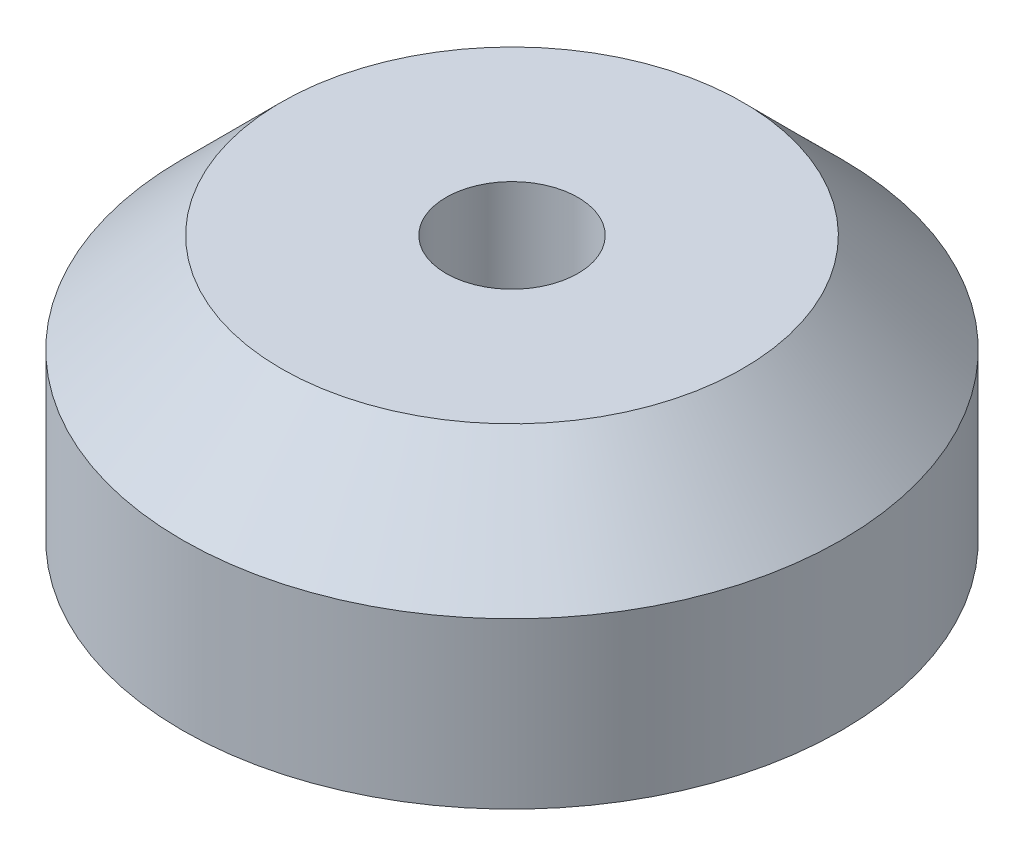
ISO-10303-21;
HEADER;
FILE_DESCRIPTION(('STEP AP214'),'2;1');
FILE_NAME('part.step','',(''),(''),'','','');
FILE_SCHEMA(('AUTOMOTIVE_DESIGN { 1 0 10303 214 1 1 1 1 }'));
ENDSEC;
DATA;
#1=APPLICATION_CONTEXT('core data for automotive mechanical design processes');
#2=APPLICATION_PROTOCOL_DEFINITION('international standard','automotive_design',2000,#1);
#3=PRODUCT_CONTEXT('',#1,'mechanical');
#4=PRODUCT('Part','Part','',(#3));
#5=PRODUCT_RELATED_PRODUCT_CATEGORY('part','',(#4));
#6=PRODUCT_DEFINITION_FORMATION('','',#4);
#7=PRODUCT_DEFINITION_CONTEXT('part definition',#1,'design');
#8=PRODUCT_DEFINITION('design','',#6,#7);
#9=PRODUCT_DEFINITION_SHAPE('','',#8);
#10=(LENGTH_UNIT() NAMED_UNIT(*) SI_UNIT(.MILLI.,.METRE.));
#11=(NAMED_UNIT(*) PLANE_ANGLE_UNIT() SI_UNIT($,.RADIAN.));
#12=(NAMED_UNIT(*) SI_UNIT($,.STERADIAN.) SOLID_ANGLE_UNIT());
#13=UNCERTAINTY_MEASURE_WITH_UNIT(LENGTH_MEASURE(1.E-05),#10,'distance_accuracy_value','');
#14=(GEOMETRIC_REPRESENTATION_CONTEXT(3) GLOBAL_UNCERTAINTY_ASSIGNED_CONTEXT((#13)) GLOBAL_UNIT_ASSIGNED_CONTEXT((#10,
#11,#12)) REPRESENTATION_CONTEXT('',''));
#15=CARTESIAN_POINT('',(0.,0.,0.));
#16=DIRECTION('',(0.,0.,1.));
#17=DIRECTION('',(1.,0.,0.));
#18=AXIS2_PLACEMENT_3D('',#15,#16,#17);
#19=CARTESIAN_POINT('',(0.,0.,0.));
#20=DIRECTION('',(0.,1.,0.));
#21=DIRECTION('',(0.,0.,1.));
#22=AXIS2_PLACEMENT_3D('',#19,#20,#21);
#23=PLANE('',#22);
#24=CARTESIAN_POINT('',(0.,0.,0.));
#25=DIRECTION('',(0.,1.,0.));
#26=DIRECTION('',(0.,0.,1.));
#27=AXIS2_PLACEMENT_3D('',#24,#25,#26);
#28=CIRCLE('',#27,10.);
#29=CARTESIAN_POINT('',(0.,0.,10.));
#30=VERTEX_POINT('',#29);
#31=EDGE_CURVE('E49',#30,#30,#28,.T.);
#32=ORIENTED_EDGE('',*,*,#31,.T.);
#33=EDGE_LOOP('',(#32));
#34=FACE_BOUND('',#33,.T.);
#35=CARTESIAN_POINT('',(0.,0.,0.));
#36=DIRECTION('',(0.,1.,0.));
#37=DIRECTION('',(0.,0.,1.));
#38=AXIS2_PLACEMENT_3D('',#35,#36,#37);
#39=CIRCLE('',#38,13.);
#40=CARTESIAN_POINT('',(0.,0.,13.));
#41=VERTEX_POINT('',#40);
#42=EDGE_CURVE('E60',#41,#41,#39,.T.);
#43=ORIENTED_EDGE('',*,*,#42,.F.);
#44=EDGE_LOOP('',(#43));
#45=FACE_BOUND('',#44,.T.);
#46=ADVANCED_FACE('F31',(#34,#45),#23,.F.);
#47=CARTESIAN_POINT('',(0.,40.,0.));
#48=DIRECTION('',(0.,1.,0.));
#49=DIRECTION('',(0.,0.,1.));
#50=AXIS2_PLACEMENT_3D('',#47,#48,#49);
#51=PLANE('',#50);
#52=CARTESIAN_POINT('',(0.,40.,0.));
#53=DIRECTION('',(0.,1.,0.));
#54=DIRECTION('',(0.,0.,1.));
#55=AXIS2_PLACEMENT_3D('',#52,#53,#54);
#56=CIRCLE('',#55,35.);
#57=CARTESIAN_POINT('',(0.,40.,35.));
#58=VERTEX_POINT('',#57);
#59=EDGE_CURVE('E38',#58,#58,#56,.T.);
#60=ORIENTED_EDGE('',*,*,#59,.T.);
#61=EDGE_LOOP('',(#60));
#62=FACE_BOUND('',#61,.T.);
#63=CARTESIAN_POINT('',(0.,40.,0.));
#64=DIRECTION('',(0.,1.,0.));
#65=DIRECTION('',(0.,0.,1.));
#66=AXIS2_PLACEMENT_3D('',#63,#64,#65);
#67=CIRCLE('',#66,10.);
#68=CARTESIAN_POINT('',(0.,40.,10.));
#69=VERTEX_POINT('',#68);
#70=EDGE_CURVE('E46',#69,#69,#67,.T.);
#71=ORIENTED_EDGE('',*,*,#70,.F.);
#72=EDGE_LOOP('',(#71));
#73=FACE_BOUND('',#72,.T.);
#74=ADVANCED_FACE('F86',(#62,#73),#51,.T.);
#75=CARTESIAN_POINT('',(0.,0.,0.));
#76=DIRECTION('',(0.,1.,0.));
#77=DIRECTION('',(0.,0.,1.));
#78=AXIS2_PLACEMENT_3D('',#75,#76,#77);
#79=CIRCLE('',#78,47.);
#80=CARTESIAN_POINT('',(0.,0.,47.));
#81=VERTEX_POINT('',#80);
#82=EDGE_CURVE('E55',#81,#81,#79,.T.);
#83=ORIENTED_EDGE('',*,*,#82,.T.);
#84=EDGE_LOOP('',(#83));
#85=FACE_BOUND('',#84,.T.);
#86=CARTESIAN_POINT('',(0.,0.,0.));
#87=DIRECTION('',(0.,1.,0.));
#88=DIRECTION('',(0.,0.,1.));
#89=AXIS2_PLACEMENT_3D('',#86,#87,#88);
#90=CIRCLE('',#89,50.);
#91=CARTESIAN_POINT('',(0.,0.,50.));
#92=VERTEX_POINT('',#91);
#93=EDGE_CURVE('E42',#92,#92,#90,.T.);
#94=ORIENTED_EDGE('',*,*,#93,.F.);
#95=EDGE_LOOP('',(#94));
#96=FACE_BOUND('',#95,.T.);
#97=ADVANCED_FACE('F89',(#85,#96),#23,.F.);
#98=CARTESIAN_POINT('',(0.,40.,0.));
#99=DIRECTION('',(0.,-1.,0.));
#100=DIRECTION('',(0.,0.,-1.));
#101=AXIS2_PLACEMENT_3D('',#98,#99,#100);
#102=CYLINDRICAL_SURFACE('',#101,50.);
#103=CARTESIAN_POINT('',(0.,25.,0.));
#104=DIRECTION('',(0.,1.,0.));
#105=DIRECTION('',(0.,0.,1.));
#106=AXIS2_PLACEMENT_3D('',#103,#104,#105);
#107=CIRCLE('',#106,50.);
#108=CARTESIAN_POINT('',(0.,25.,50.));
#109=VERTEX_POINT('',#108);
#110=EDGE_CURVE('E10',#109,#109,#107,.F.);
#111=ORIENTED_EDGE('',*,*,#110,.T.);
#112=EDGE_LOOP('',(#111));
#113=FACE_BOUND('',#112,.T.);
#114=ORIENTED_EDGE('',*,*,#93,.T.);
#115=EDGE_LOOP('',(#114));
#116=FACE_BOUND('',#115,.T.);
#117=ADVANCED_FACE('F95',(#113,#116),#102,.T.);
#118=CARTESIAN_POINT('',(0.,40.,0.));
#119=DIRECTION('',(0.,-1.,0.));
#120=DIRECTION('',(0.,0.,-1.));
#121=AXIS2_PLACEMENT_3D('',#118,#119,#120);
#122=CYLINDRICAL_SURFACE('',#121,10.);
#123=ORIENTED_EDGE('',*,*,#70,.T.);
#124=EDGE_LOOP('',(#123));
#125=FACE_BOUND('',#124,.T.);
#126=ORIENTED_EDGE('',*,*,#31,.F.);
#127=EDGE_LOOP('',(#126));
#128=FACE_BOUND('',#127,.T.);
#129=ADVANCED_FACE('F100',(#125,#128),#122,.F.);
#130=CARTESIAN_POINT('',(0.,40.,0.));
#131=DIRECTION('',(0.,-1.,0.));
#132=DIRECTION('',(0.,0.,-1.));
#133=AXIS2_PLACEMENT_3D('',#130,#131,#132);
#134=CONICAL_SURFACE('',#133,35.,0.785398163397446);
#135=ORIENTED_EDGE('',*,*,#110,.F.);
#136=EDGE_LOOP('',(#135));
#137=FACE_BOUND('',#136,.T.);
#138=ORIENTED_EDGE('',*,*,#59,.F.);
#139=EDGE_LOOP('',(#138));
#140=FACE_BOUND('',#139,.T.);
#141=ADVANCED_FACE('F33',(#137,#140),#134,.T.);
#142=CARTESIAN_POINT('',(0.,37.,0.));
#143=DIRECTION('',(0.,1.,0.));
#144=DIRECTION('',(0.,0.,1.));
#145=AXIS2_PLACEMENT_3D('',#142,#143,#144);
#146=PLANE('',#145);
#147=CARTESIAN_POINT('',(0.,37.,0.));
#148=DIRECTION('',(0.,1.,0.));
#149=DIRECTION('',(0.,0.,1.));
#150=AXIS2_PLACEMENT_3D('',#147,#148,#149);
#151=CIRCLE('',#150,33.7573593128807);
#152=CARTESIAN_POINT('',(0.,37.,33.7573593128807));
#153=VERTEX_POINT('',#152);
#154=EDGE_CURVE('E58',#153,#153,#151,.T.);
#155=ORIENTED_EDGE('',*,*,#154,.F.);
#156=EDGE_LOOP('',(#155));
#157=FACE_BOUND('',#156,.T.);
#158=CARTESIAN_POINT('',(0.,37.,0.));
#159=DIRECTION('',(0.,1.,0.));
#160=DIRECTION('',(0.,0.,1.));
#161=AXIS2_PLACEMENT_3D('',#158,#159,#160);
#162=CIRCLE('',#161,13.);
#163=CARTESIAN_POINT('',(0.,37.,13.));
#164=VERTEX_POINT('',#163);
#165=EDGE_CURVE('E59',#164,#164,#162,.T.);
#166=ORIENTED_EDGE('',*,*,#165,.T.);
#167=EDGE_LOOP('',(#166));
#168=FACE_BOUND('',#167,.T.);
#169=ADVANCED_FACE('F72',(#157,#168),#146,.F.);
#170=CARTESIAN_POINT('',(0.,40.,0.));
#171=DIRECTION('',(0.,-1.,0.));
#172=DIRECTION('',(0.,0.,-1.));
#173=AXIS2_PLACEMENT_3D('',#170,#171,#172);
#174=CYLINDRICAL_SURFACE('',#173,47.);
#175=CARTESIAN_POINT('',(0.,23.7573593128807,0.));
#176=DIRECTION('',(0.,-1.,0.));
#177=DIRECTION('',(0.,0.,-1.));
#178=AXIS2_PLACEMENT_3D('',#175,#176,#177);
#179=CIRCLE('',#178,47.);
#180=CARTESIAN_POINT('',(0.,23.7573593128807,-47.));
#181=VERTEX_POINT('',#180);
#182=EDGE_CURVE('E52',#181,#181,#179,.T.);
#183=ORIENTED_EDGE('',*,*,#182,.F.);
#184=EDGE_LOOP('',(#183));
#185=FACE_BOUND('',#184,.T.);
#186=ORIENTED_EDGE('',*,*,#82,.F.);
#187=EDGE_LOOP('',(#186));
#188=FACE_BOUND('',#187,.T.);
#189=ADVANCED_FACE('F75',(#185,#188),#174,.F.);
#190=CARTESIAN_POINT('',(0.,40.,0.));
#191=DIRECTION('',(0.,-1.,0.));
#192=DIRECTION('',(0.,0.,-1.));
#193=AXIS2_PLACEMENT_3D('',#190,#191,#192);
#194=CYLINDRICAL_SURFACE('',#193,13.);
#195=ORIENTED_EDGE('',*,*,#165,.F.);
#196=EDGE_LOOP('',(#195));
#197=FACE_BOUND('',#196,.T.);
#198=ORIENTED_EDGE('',*,*,#42,.T.);
#199=EDGE_LOOP('',(#198));
#200=FACE_BOUND('',#199,.T.);
#201=ADVANCED_FACE('F79',(#197,#200),#194,.T.);
#202=CARTESIAN_POINT('',(0.,37.8786796564404,0.));
#203=DIRECTION('',(0.,-1.,0.));
#204=DIRECTION('',(0.,0.,-1.));
#205=AXIS2_PLACEMENT_3D('',#202,#203,#204);
#206=CONICAL_SURFACE('',#205,32.8786796564404,0.785398163397446);
#207=ORIENTED_EDGE('',*,*,#182,.T.);
#208=EDGE_LOOP('',(#207));
#209=FACE_BOUND('',#208,.T.);
#210=ORIENTED_EDGE('',*,*,#154,.T.);
#211=EDGE_LOOP('',(#210));
#212=FACE_BOUND('',#211,.T.);
#213=ADVANCED_FACE('F70',(#209,#212),#206,.F.);
#214=CLOSED_SHELL('',(#46,#74,#97,#117,#129,#141,#169,#189,#201,#213));
#215=MANIFOLD_SOLID_BREP('B2',#214);
#216=ADVANCED_BREP_SHAPE_REPRESENTATION('',(#18,#215),#14);
#217=SHAPE_DEFINITION_REPRESENTATION(#9,#216);
ENDSEC;
END-ISO-10303-21;
